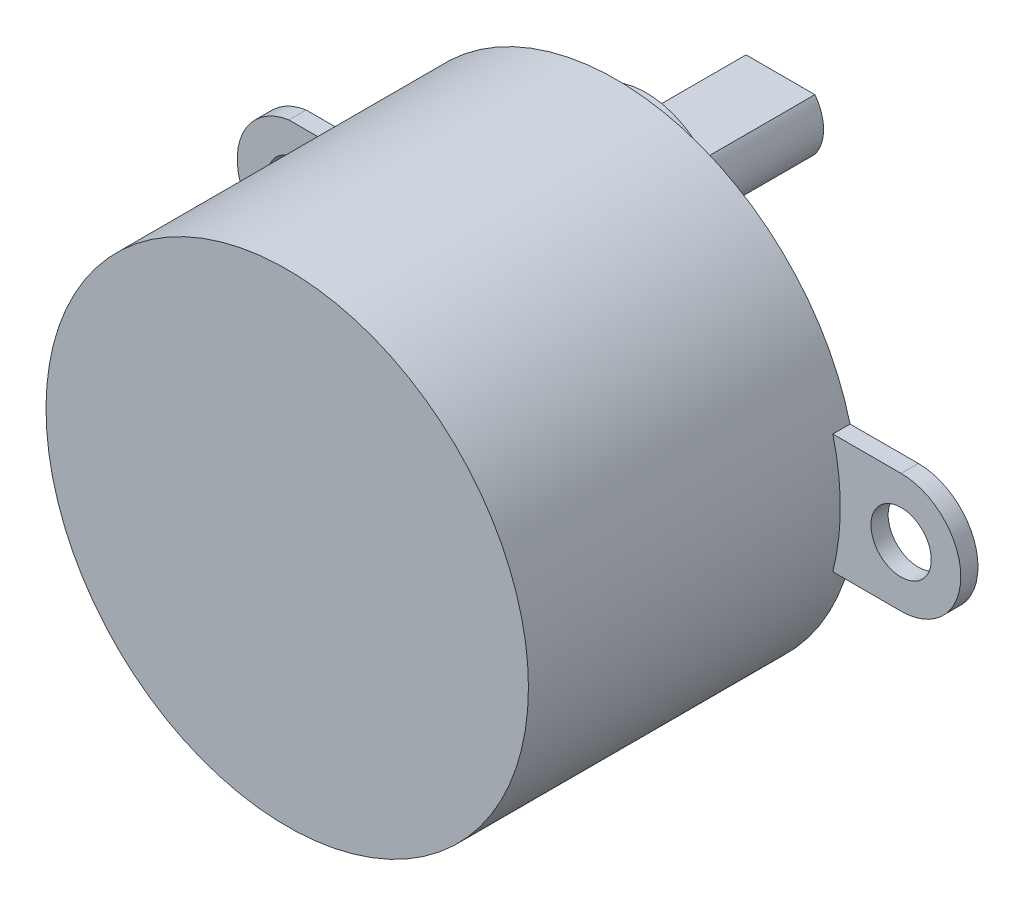
ISO-10303-21;
HEADER;
FILE_DESCRIPTION(('STEP AP214'),'2;1');
FILE_NAME('part.step','',(''),(''),'','','');
FILE_SCHEMA(('AUTOMOTIVE_DESIGN { 1 0 10303 214 1 1 1 1 }'));
ENDSEC;
DATA;
#1=APPLICATION_CONTEXT('core data for automotive mechanical design processes');
#2=APPLICATION_PROTOCOL_DEFINITION('international standard','automotive_design',2000,#1);
#3=PRODUCT_CONTEXT('',#1,'mechanical');
#4=PRODUCT('Part','Part','',(#3));
#5=PRODUCT_RELATED_PRODUCT_CATEGORY('part','',(#4));
#6=PRODUCT_DEFINITION_FORMATION('','',#4);
#7=PRODUCT_DEFINITION_CONTEXT('part definition',#1,'design');
#8=PRODUCT_DEFINITION('design','',#6,#7);
#9=PRODUCT_DEFINITION_SHAPE('','',#8);
#10=(LENGTH_UNIT() NAMED_UNIT(*) SI_UNIT(.MILLI.,.METRE.));
#11=(NAMED_UNIT(*) PLANE_ANGLE_UNIT() SI_UNIT($,.RADIAN.));
#12=(NAMED_UNIT(*) SI_UNIT($,.STERADIAN.) SOLID_ANGLE_UNIT());
#13=UNCERTAINTY_MEASURE_WITH_UNIT(LENGTH_MEASURE(1.E-05),#10,'distance_accuracy_value','');
#14=(GEOMETRIC_REPRESENTATION_CONTEXT(3) GLOBAL_UNCERTAINTY_ASSIGNED_CONTEXT((#13)) GLOBAL_UNIT_ASSIGNED_CONTEXT((#10,
#11,#12)) REPRESENTATION_CONTEXT('',''));
#15=CARTESIAN_POINT('',(0.,0.,0.));
#16=DIRECTION('',(0.,0.,1.));
#17=DIRECTION('',(1.,0.,0.));
#18=AXIS2_PLACEMENT_3D('',#15,#16,#17);
#19=CARTESIAN_POINT('',(0.,0.,19.1));
#20=DIRECTION('',(0.,0.,-1.));
#21=DIRECTION('',(-1.,0.,0.));
#22=AXIS2_PLACEMENT_3D('',#19,#20,#21);
#23=CYLINDRICAL_SURFACE('',#22,14.);
#24=CARTESIAN_POINT('',(0.,0.,19.1));
#25=DIRECTION('',(0.,0.,1.));
#26=DIRECTION('',(1.,0.,0.));
#27=AXIS2_PLACEMENT_3D('',#24,#25,#26);
#28=CIRCLE('',#27,14.);
#29=CARTESIAN_POINT('',(14.,0.,19.1));
#30=VERTEX_POINT('',#29);
#31=EDGE_CURVE('E11',#30,#30,#28,.T.);
#32=ORIENTED_EDGE('',*,*,#31,.F.);
#33=EDGE_LOOP('',(#32));
#34=FACE_BOUND('',#33,.T.);
#35=DIRECTION('',(0.,0.,-1.));
#36=VECTOR('',#35,1.);
#37=CARTESIAN_POINT('',(13.5647981073265,3.46356064007417,1.));
#38=LINE('',#37,#36);
#39=CARTESIAN_POINT('',(13.5647981073265,3.46356064007417,1.));
#40=VERTEX_POINT('',#39);
#41=CARTESIAN_POINT('',(13.5647981073265,3.46356064007417,0.));
#42=VERTEX_POINT('',#41);
#43=EDGE_CURVE('E142',#40,#42,#38,.T.);
#44=ORIENTED_EDGE('',*,*,#43,.T.);
#45=CARTESIAN_POINT('',(0.,0.,0.));
#46=DIRECTION('',(0.,0.,1.));
#47=DIRECTION('',(1.,0.,0.));
#48=AXIS2_PLACEMENT_3D('',#45,#46,#47);
#49=CIRCLE('',#48,14.);
#50=CARTESIAN_POINT('',(-13.5647981073265,3.46356064007417,0.));
#51=VERTEX_POINT('',#50);
#52=EDGE_CURVE('E250',#42,#51,#49,.T.);
#53=ORIENTED_EDGE('',*,*,#52,.T.);
#54=DIRECTION('',(0.,0.,-1.));
#55=VECTOR('',#54,1.);
#56=CARTESIAN_POINT('',(-13.5647981073265,3.46356064007417,1.));
#57=LINE('',#56,#55);
#58=CARTESIAN_POINT('',(-13.5647981073265,3.46356064007417,1.));
#59=VERTEX_POINT('',#58);
#60=EDGE_CURVE('E188',#59,#51,#57,.T.);
#61=ORIENTED_EDGE('',*,*,#60,.F.);
#62=CARTESIAN_POINT('',(0.,0.,1.));
#63=DIRECTION('',(0.,0.,1.));
#64=DIRECTION('',(1.,0.,0.));
#65=AXIS2_PLACEMENT_3D('',#62,#63,#64);
#66=CIRCLE('',#65,14.);
#67=CARTESIAN_POINT('',(-13.5647981073265,-3.46356064007417,1.));
#68=VERTEX_POINT('',#67);
#69=EDGE_CURVE('E186',#59,#68,#66,.T.);
#70=ORIENTED_EDGE('',*,*,#69,.T.);
#71=DIRECTION('',(0.,0.,-1.));
#72=VECTOR('',#71,1.);
#73=CARTESIAN_POINT('',(-13.5647981073265,-3.46356064007417,1.));
#74=LINE('',#73,#72);
#75=CARTESIAN_POINT('',(-13.5647981073265,-3.46356064007417,0.));
#76=VERTEX_POINT('',#75);
#77=EDGE_CURVE('E201',#68,#76,#74,.T.);
#78=ORIENTED_EDGE('',*,*,#77,.T.);
#79=CARTESIAN_POINT('',(13.5647981073265,-3.46356064007417,0.));
#80=VERTEX_POINT('',#79);
#81=EDGE_CURVE('E46',#76,#80,#49,.T.);
#82=ORIENTED_EDGE('',*,*,#81,.T.);
#83=DIRECTION('',(0.,0.,-1.));
#84=VECTOR('',#83,1.);
#85=CARTESIAN_POINT('',(13.5647981073265,-3.46356064007417,1.));
#86=LINE('',#85,#84);
#87=CARTESIAN_POINT('',(13.5647981073265,-3.46356064007417,1.));
#88=VERTEX_POINT('',#87);
#89=EDGE_CURVE('E62',#88,#80,#86,.T.);
#90=ORIENTED_EDGE('',*,*,#89,.F.);
#91=CARTESIAN_POINT('',(0.,0.,1.));
#92=DIRECTION('',(0.,0.,1.));
#93=DIRECTION('',(1.,0.,0.));
#94=AXIS2_PLACEMENT_3D('',#91,#92,#93);
#95=CIRCLE('',#94,14.);
#96=EDGE_CURVE('E57',#88,#40,#95,.T.);
#97=ORIENTED_EDGE('',*,*,#96,.T.);
#98=EDGE_LOOP('',(#44,#53,#61,#70,#78,#82,#90,#97));
#99=FACE_BOUND('',#98,.T.);
#100=ADVANCED_FACE('F43',(#34,#99),#23,.T.);
#101=CARTESIAN_POINT('',(0.,6.49995208758909,-9.5));
#102=DIRECTION('',(0.,-1.,0.));
#103=DIRECTION('',(0.,0.,-1.));
#104=AXIS2_PLACEMENT_3D('',#101,#102,#103);
#105=PLANE('',#104);
#106=DIRECTION('',(0.,0.,1.));
#107=VECTOR('',#106,1.);
#108=CARTESIAN_POINT('',(2.0276874751277,6.49995208758909,-9.5));
#109=LINE('',#108,#107);
#110=CARTESIAN_POINT('',(2.0276874751277,6.49995208758909,-9.5));
#111=VERTEX_POINT('',#110);
#112=CARTESIAN_POINT('',(2.0276874751277,6.49995208758909,-2.3));
#113=VERTEX_POINT('',#112);
#114=EDGE_CURVE('E225',#111,#113,#109,.T.);
#115=ORIENTED_EDGE('',*,*,#114,.T.);
#116=DIRECTION('',(1.,0.,0.));
#117=VECTOR('',#116,1.);
#118=CARTESIAN_POINT('',(0.,6.49995208758909,-2.3));
#119=LINE('',#118,#117);
#120=CARTESIAN_POINT('',(-1.97231252487231,6.49995208758909,-2.3));
#121=VERTEX_POINT('',#120);
#122=EDGE_CURVE('E209',#121,#113,#119,.T.);
#123=ORIENTED_EDGE('',*,*,#122,.F.);
#124=DIRECTION('',(0.,0.,1.));
#125=VECTOR('',#124,1.);
#126=CARTESIAN_POINT('',(-1.97231252487231,6.49995208758909,-9.5));
#127=LINE('',#126,#125);
#128=CARTESIAN_POINT('',(-1.97231252487231,6.49995208758909,-9.5));
#129=VERTEX_POINT('',#128);
#130=EDGE_CURVE('E226',#129,#121,#127,.T.);
#131=ORIENTED_EDGE('',*,*,#130,.F.);
#132=DIRECTION('',(1.,0.,0.));
#133=VECTOR('',#132,1.);
#134=CARTESIAN_POINT('',(0.,6.49995208758909,-9.5));
#135=LINE('',#134,#133);
#136=EDGE_CURVE('E214',#129,#111,#135,.T.);
#137=ORIENTED_EDGE('',*,*,#136,.T.);
#138=EDGE_LOOP('',(#115,#123,#131,#137));
#139=FACE_BOUND('',#138,.T.);
#140=ADVANCED_FACE('F272',(#139),#105,.T.);
#141=CARTESIAN_POINT('',(0.,0.,19.1));
#142=DIRECTION('',(0.,0.,1.));
#143=DIRECTION('',(1.,0.,0.));
#144=AXIS2_PLACEMENT_3D('',#141,#142,#143);
#145=PLANE('',#144);
#146=ORIENTED_EDGE('',*,*,#31,.T.);
#147=EDGE_LOOP('',(#146));
#148=FACE_BOUND('',#147,.T.);
#149=ADVANCED_FACE('F269',(#148),#145,.T.);
#150=CARTESIAN_POINT('',(0.,0.,0.));
#151=DIRECTION('',(0.,0.,1.));
#152=DIRECTION('',(1.,0.,0.));
#153=AXIS2_PLACEMENT_3D('',#150,#151,#152);
#154=PLANE('',#153);
#155=CARTESIAN_POINT('',(0.0276874751276953,7.99995208758909,0.));
#156=DIRECTION('',(0.,0.,1.));
#157=DIRECTION('',(1.,0.,0.));
#158=AXIS2_PLACEMENT_3D('',#155,#156,#157);
#159=CIRCLE('',#158,4.5);
#160=CARTESIAN_POINT('',(4.52768747512769,7.99995208758909,0.));
#161=VERTEX_POINT('',#160);
#162=EDGE_CURVE('E243',#161,#161,#159,.T.);
#163=ORIENTED_EDGE('',*,*,#162,.T.);
#164=EDGE_LOOP('',(#163));
#165=FACE_BOUND('',#164,.T.);
#166=ORIENTED_EDGE('',*,*,#81,.F.);
#167=DIRECTION('',(1.,0.,0.));
#168=VECTOR('',#167,1.);
#169=CARTESIAN_POINT('',(0.,-3.46356064007417,0.));
#170=LINE('',#169,#168);
#171=CARTESIAN_POINT('',(-18.0037337516278,-3.46356064007417,0.));
#172=VERTEX_POINT('',#171);
#173=EDGE_CURVE('E177',#172,#76,#170,.T.);
#174=ORIENTED_EDGE('',*,*,#173,.F.);
#175=CARTESIAN_POINT('',(-17.5,0.,0.));
#176=DIRECTION('',(0.,0.,1.));
#177=DIRECTION('',(1.,0.,0.));
#178=AXIS2_PLACEMENT_3D('',#175,#176,#177);
#179=CIRCLE('',#178,3.5);
#180=CARTESIAN_POINT('',(-18.0037337516278,3.46356064007417,0.));
#181=VERTEX_POINT('',#180);
#182=EDGE_CURVE('E194',#181,#172,#179,.T.);
#183=ORIENTED_EDGE('',*,*,#182,.F.);
#184=DIRECTION('',(1.,0.,0.));
#185=VECTOR('',#184,1.);
#186=CARTESIAN_POINT('',(0.,3.46356064007417,0.));
#187=LINE('',#186,#185);
#188=EDGE_CURVE('E191',#181,#51,#187,.T.);
#189=ORIENTED_EDGE('',*,*,#188,.T.);
#190=ORIENTED_EDGE('',*,*,#52,.F.);
#191=DIRECTION('',(-1.,0.,0.));
#192=VECTOR('',#191,1.);
#193=CARTESIAN_POINT('',(0.,3.46356064007417,0.));
#194=LINE('',#193,#192);
#195=CARTESIAN_POINT('',(17.5276874751277,3.46356064007417,0.));
#196=VERTEX_POINT('',#195);
#197=EDGE_CURVE('E166',#196,#42,#194,.T.);
#198=ORIENTED_EDGE('',*,*,#197,.F.);
#199=CARTESIAN_POINT('',(17.5276874751277,0.,0.));
#200=DIRECTION('',(0.,0.,1.));
#201=DIRECTION('',(1.,0.,0.));
#202=AXIS2_PLACEMENT_3D('',#199,#200,#201);
#203=CIRCLE('',#202,3.46356064007417);
#204=CARTESIAN_POINT('',(17.5276874751277,-3.46356064007417,0.));
#205=VERTEX_POINT('',#204);
#206=EDGE_CURVE('E137',#196,#205,#203,.F.);
#207=ORIENTED_EDGE('',*,*,#206,.T.);
#208=DIRECTION('',(-1.,0.,0.));
#209=VECTOR('',#208,1.);
#210=CARTESIAN_POINT('',(0.,-3.46356064007417,0.));
#211=LINE('',#210,#209);
#212=EDGE_CURVE('E156',#205,#80,#211,.T.);
#213=ORIENTED_EDGE('',*,*,#212,.T.);
#214=EDGE_LOOP('',(#166,#174,#183,#189,#190,#198,#207,#213));
#215=FACE_BOUND('',#214,.T.);
#216=CARTESIAN_POINT('',(-17.5,0.,0.));
#217=DIRECTION('',(0.,0.,1.));
#218=DIRECTION('',(1.,0.,0.));
#219=AXIS2_PLACEMENT_3D('',#216,#217,#218);
#220=CIRCLE('',#219,1.75);
#221=CARTESIAN_POINT('',(-15.75,0.,0.));
#222=VERTEX_POINT('',#221);
#223=EDGE_CURVE('E141',#222,#222,#220,.T.);
#224=ORIENTED_EDGE('',*,*,#223,.T.);
#225=EDGE_LOOP('',(#224));
#226=FACE_BOUND('',#225,.T.);
#227=CARTESIAN_POINT('',(17.5276874751277,0.,0.));
#228=DIRECTION('',(0.,0.,1.));
#229=DIRECTION('',(1.,0.,0.));
#230=AXIS2_PLACEMENT_3D('',#227,#228,#229);
#231=CIRCLE('',#230,1.75);
#232=CARTESIAN_POINT('',(19.2776874751277,0.,0.));
#233=VERTEX_POINT('',#232);
#234=EDGE_CURVE('E153',#233,#233,#231,.T.);
#235=ORIENTED_EDGE('',*,*,#234,.T.);
#236=EDGE_LOOP('',(#235));
#237=FACE_BOUND('',#236,.T.);
#238=ADVANCED_FACE('F254',(#165,#215,#226,#237),#154,.F.);
#239=CARTESIAN_POINT('',(0.0276874751276953,7.99995208758909,-1.7));
#240=DIRECTION('',(0.,0.,1.));
#241=DIRECTION('',(1.,0.,0.));
#242=AXIS2_PLACEMENT_3D('',#239,#240,#241);
#243=CYLINDRICAL_SURFACE('',#242,4.5);
#244=CARTESIAN_POINT('',(0.0276874751276953,7.99995208758909,-1.7));
#245=DIRECTION('',(0.,0.,1.));
#246=DIRECTION('',(1.,0.,0.));
#247=AXIS2_PLACEMENT_3D('',#244,#245,#246);
#248=CIRCLE('',#247,4.5);
#249=CARTESIAN_POINT('',(4.52768747512769,7.99995208758909,-1.7));
#250=VERTEX_POINT('',#249);
#251=EDGE_CURVE('E247',#250,#250,#248,.T.);
#252=ORIENTED_EDGE('',*,*,#251,.T.);
#253=EDGE_LOOP('',(#252));
#254=FACE_BOUND('',#253,.T.);
#255=ORIENTED_EDGE('',*,*,#162,.F.);
#256=EDGE_LOOP('',(#255));
#257=FACE_BOUND('',#256,.T.);
#258=ADVANCED_FACE('F257',(#254,#257),#243,.T.);
#259=CARTESIAN_POINT('',(0.,0.,-1.7));
#260=DIRECTION('',(0.,0.,1.));
#261=DIRECTION('',(1.,0.,0.));
#262=AXIS2_PLACEMENT_3D('',#259,#260,#261);
#263=PLANE('',#262);
#264=CARTESIAN_POINT('',(0.0276874751276953,7.99995208758909,-1.7));
#265=DIRECTION('',(0.,0.,1.));
#266=DIRECTION('',(1.,0.,0.));
#267=AXIS2_PLACEMENT_3D('',#264,#265,#266);
#268=CIRCLE('',#267,2.5);
#269=CARTESIAN_POINT('',(2.5276874751277,7.99995208758909,-1.7));
#270=VERTEX_POINT('',#269);
#271=EDGE_CURVE('E244',#270,#270,#268,.T.);
#272=ORIENTED_EDGE('',*,*,#271,.T.);
#273=EDGE_LOOP('',(#272));
#274=FACE_BOUND('',#273,.T.);
#275=ORIENTED_EDGE('',*,*,#251,.F.);
#276=EDGE_LOOP('',(#275));
#277=FACE_BOUND('',#276,.T.);
#278=ADVANCED_FACE('F259',(#274,#277),#263,.F.);
#279=CARTESIAN_POINT('',(0.0276874751276953,7.99995208758909,-2.3));
#280=DIRECTION('',(0.,0.,1.));
#281=DIRECTION('',(1.,0.,0.));
#282=AXIS2_PLACEMENT_3D('',#279,#280,#281);
#283=CYLINDRICAL_SURFACE('',#282,2.5);
#284=ORIENTED_EDGE('',*,*,#271,.F.);
#285=EDGE_LOOP('',(#284));
#286=FACE_BOUND('',#285,.T.);
#287=CARTESIAN_POINT('',(0.0276874751276953,7.99995208758909,-2.3));
#288=DIRECTION('',(0.,0.,1.));
#289=DIRECTION('',(1.,0.,0.));
#290=AXIS2_PLACEMENT_3D('',#287,#288,#289);
#291=CIRCLE('',#290,2.5);
#292=EDGE_CURVE('E211',#121,#113,#291,.T.);
#293=ORIENTED_EDGE('',*,*,#292,.T.);
#294=ORIENTED_EDGE('',*,*,#114,.F.);
#295=CARTESIAN_POINT('',(0.0276874751276953,7.99995208758909,-9.5));
#296=DIRECTION('',(0.,0.,1.));
#297=DIRECTION('',(1.,0.,0.));
#298=AXIS2_PLACEMENT_3D('',#295,#296,#297);
#299=CIRCLE('',#298,2.5);
#300=CARTESIAN_POINT('',(2.02768747512769,9.49995208758909,-9.5));
#301=VERTEX_POINT('',#300);
#302=EDGE_CURVE('E217',#111,#301,#299,.T.);
#303=ORIENTED_EDGE('',*,*,#302,.T.);
#304=DIRECTION('',(0.,0.,1.));
#305=VECTOR('',#304,1.);
#306=CARTESIAN_POINT('',(2.02768747512769,9.49995208758909,-9.5));
#307=LINE('',#306,#305);
#308=CARTESIAN_POINT('',(2.02768747512769,9.49995208758909,-2.3));
#309=VERTEX_POINT('',#308);
#310=EDGE_CURVE('E233',#301,#309,#307,.T.);
#311=ORIENTED_EDGE('',*,*,#310,.T.);
#312=CARTESIAN_POINT('',(0.0276874751276953,7.99995208758909,-2.3));
#313=DIRECTION('',(0.,0.,1.));
#314=DIRECTION('',(1.,0.,0.));
#315=AXIS2_PLACEMENT_3D('',#312,#313,#314);
#316=CIRCLE('',#315,2.5);
#317=CARTESIAN_POINT('',(-1.97231252487231,9.49995208758909,-2.3));
#318=VERTEX_POINT('',#317);
#319=EDGE_CURVE('E240',#309,#318,#316,.T.);
#320=ORIENTED_EDGE('',*,*,#319,.T.);
#321=DIRECTION('',(0.,0.,1.));
#322=VECTOR('',#321,1.);
#323=CARTESIAN_POINT('',(-1.97231252487231,9.49995208758909,-9.5));
#324=LINE('',#323,#322);
#325=CARTESIAN_POINT('',(-1.97231252487231,9.49995208758909,-9.5));
#326=VERTEX_POINT('',#325);
#327=EDGE_CURVE('E230',#326,#318,#324,.T.);
#328=ORIENTED_EDGE('',*,*,#327,.F.);
#329=CARTESIAN_POINT('',(0.0276874751276953,7.99995208758909,-9.5));
#330=DIRECTION('',(0.,0.,1.));
#331=DIRECTION('',(1.,0.,0.));
#332=AXIS2_PLACEMENT_3D('',#329,#330,#331);
#333=CIRCLE('',#332,2.5);
#334=EDGE_CURVE('E222',#326,#129,#333,.T.);
#335=ORIENTED_EDGE('',*,*,#334,.T.);
#336=ORIENTED_EDGE('',*,*,#130,.T.);
#337=EDGE_LOOP('',(#293,#294,#303,#311,#320,#328,#335,#336));
#338=FACE_BOUND('',#337,.T.);
#339=ADVANCED_FACE('F266',(#286,#338),#283,.T.);
#340=CARTESIAN_POINT('',(0.,0.,-2.3));
#341=DIRECTION('',(0.,0.,1.));
#342=DIRECTION('',(1.,0.,0.));
#343=AXIS2_PLACEMENT_3D('',#340,#341,#342);
#344=PLANE('',#343);
#345=DIRECTION('',(1.,0.,0.));
#346=VECTOR('',#345,1.);
#347=CARTESIAN_POINT('',(0.,9.49995208758909,-2.3));
#348=LINE('',#347,#346);
#349=EDGE_CURVE('E229',#318,#309,#348,.T.);
#350=ORIENTED_EDGE('',*,*,#349,.F.);
#351=ORIENTED_EDGE('',*,*,#319,.F.);
#352=EDGE_LOOP('',(#350,#351));
#353=FACE_BOUND('',#352,.T.);
#354=ADVANCED_FACE('F331',(#353),#344,.F.);
#355=CARTESIAN_POINT('',(0.,9.49995208758909,-9.5));
#356=DIRECTION('',(0.,-1.,0.));
#357=DIRECTION('',(0.,0.,-1.));
#358=AXIS2_PLACEMENT_3D('',#355,#356,#357);
#359=PLANE('',#358);
#360=ORIENTED_EDGE('',*,*,#327,.T.);
#361=ORIENTED_EDGE('',*,*,#349,.T.);
#362=ORIENTED_EDGE('',*,*,#310,.F.);
#363=DIRECTION('',(1.,0.,0.));
#364=VECTOR('',#363,1.);
#365=CARTESIAN_POINT('',(0.,9.49995208758909,-9.5));
#366=LINE('',#365,#364);
#367=EDGE_CURVE('E220',#326,#301,#366,.T.);
#368=ORIENTED_EDGE('',*,*,#367,.F.);
#369=EDGE_LOOP('',(#360,#361,#362,#368));
#370=FACE_BOUND('',#369,.T.);
#371=ADVANCED_FACE('F328',(#370),#359,.F.);
#372=CARTESIAN_POINT('',(0.,0.,-9.5));
#373=DIRECTION('',(0.,0.,1.));
#374=DIRECTION('',(1.,0.,0.));
#375=AXIS2_PLACEMENT_3D('',#372,#373,#374);
#376=PLANE('',#375);
#377=ORIENTED_EDGE('',*,*,#136,.F.);
#378=ORIENTED_EDGE('',*,*,#334,.F.);
#379=ORIENTED_EDGE('',*,*,#367,.T.);
#380=ORIENTED_EDGE('',*,*,#302,.F.);
#381=EDGE_LOOP('',(#377,#378,#379,#380));
#382=FACE_BOUND('',#381,.T.);
#383=ADVANCED_FACE('F324',(#382),#376,.F.);
#384=CARTESIAN_POINT('',(0.,0.,-2.3));
#385=DIRECTION('',(0.,0.,1.));
#386=DIRECTION('',(1.,0.,0.));
#387=AXIS2_PLACEMENT_3D('',#384,#385,#386);
#388=PLANE('',#387);
#389=ORIENTED_EDGE('',*,*,#122,.T.);
#390=ORIENTED_EDGE('',*,*,#292,.F.);
#391=EDGE_LOOP('',(#389,#390));
#392=FACE_BOUND('',#391,.T.);
#393=ADVANCED_FACE('F317',(#392),#388,.F.);
#394=CARTESIAN_POINT('',(0.,3.46356064007417,1.));
#395=DIRECTION('',(0.,1.,0.));
#396=DIRECTION('',(0.,0.,1.));
#397=AXIS2_PLACEMENT_3D('',#394,#395,#396);
#398=PLANE('',#397);
#399=ORIENTED_EDGE('',*,*,#188,.F.);
#400=DIRECTION('',(0.,0.,-1.));
#401=VECTOR('',#400,1.);
#402=CARTESIAN_POINT('',(-18.0037337516278,3.46356064007417,1.));
#403=LINE('',#402,#401);
#404=CARTESIAN_POINT('',(-18.0037337516278,3.46356064007417,1.));
#405=VERTEX_POINT('',#404);
#406=EDGE_CURVE('E207',#405,#181,#403,.T.);
#407=ORIENTED_EDGE('',*,*,#406,.F.);
#408=DIRECTION('',(1.,0.,0.));
#409=VECTOR('',#408,1.);
#410=CARTESIAN_POINT('',(0.,3.46356064007417,1.));
#411=LINE('',#410,#409);
#412=EDGE_CURVE('E176',#405,#59,#411,.T.);
#413=ORIENTED_EDGE('',*,*,#412,.T.);
#414=ORIENTED_EDGE('',*,*,#60,.T.);
#415=EDGE_LOOP('',(#399,#407,#413,#414));
#416=FACE_BOUND('',#415,.T.);
#417=ADVANCED_FACE('F313',(#416),#398,.T.);
#418=CARTESIAN_POINT('',(-17.5,0.,1.));
#419=DIRECTION('',(0.,0.,-1.));
#420=DIRECTION('',(-1.,0.,0.));
#421=AXIS2_PLACEMENT_3D('',#418,#419,#420);
#422=CYLINDRICAL_SURFACE('',#421,3.5);
#423=ORIENTED_EDGE('',*,*,#182,.T.);
#424=DIRECTION('',(0.,0.,-1.));
#425=VECTOR('',#424,1.);
#426=CARTESIAN_POINT('',(-18.0037337516278,-3.46356064007417,1.));
#427=LINE('',#426,#425);
#428=CARTESIAN_POINT('',(-18.0037337516278,-3.46356064007417,1.));
#429=VERTEX_POINT('',#428);
#430=EDGE_CURVE('E204',#429,#172,#427,.T.);
#431=ORIENTED_EDGE('',*,*,#430,.F.);
#432=CARTESIAN_POINT('',(-17.5,0.,1.));
#433=DIRECTION('',(0.,0.,1.));
#434=DIRECTION('',(1.,0.,0.));
#435=AXIS2_PLACEMENT_3D('',#432,#433,#434);
#436=CIRCLE('',#435,3.5);
#437=EDGE_CURVE('E180',#405,#429,#436,.T.);
#438=ORIENTED_EDGE('',*,*,#437,.F.);
#439=ORIENTED_EDGE('',*,*,#406,.T.);
#440=EDGE_LOOP('',(#423,#431,#438,#439));
#441=FACE_BOUND('',#440,.T.);
#442=ADVANCED_FACE('F309',(#441),#422,.T.);
#443=CARTESIAN_POINT('',(0.,-3.46356064007417,1.));
#444=DIRECTION('',(0.,1.,0.));
#445=DIRECTION('',(0.,0.,1.));
#446=AXIS2_PLACEMENT_3D('',#443,#444,#445);
#447=PLANE('',#446);
#448=ORIENTED_EDGE('',*,*,#173,.T.);
#449=ORIENTED_EDGE('',*,*,#77,.F.);
#450=DIRECTION('',(1.,0.,0.));
#451=VECTOR('',#450,1.);
#452=CARTESIAN_POINT('',(0.,-3.46356064007417,1.));
#453=LINE('',#452,#451);
#454=EDGE_CURVE('E183',#429,#68,#453,.T.);
#455=ORIENTED_EDGE('',*,*,#454,.F.);
#456=ORIENTED_EDGE('',*,*,#430,.T.);
#457=EDGE_LOOP('',(#448,#449,#455,#456));
#458=FACE_BOUND('',#457,.T.);
#459=ADVANCED_FACE('F306',(#458),#447,.F.);
#460=CARTESIAN_POINT('',(-17.5,0.,1.));
#461=DIRECTION('',(0.,0.,-1.));
#462=DIRECTION('',(-1.,0.,0.));
#463=AXIS2_PLACEMENT_3D('',#460,#461,#462);
#464=CYLINDRICAL_SURFACE('',#463,1.75);
#465=CARTESIAN_POINT('',(-17.5,0.,1.));
#466=DIRECTION('',(0.,0.,1.));
#467=DIRECTION('',(1.,0.,0.));
#468=AXIS2_PLACEMENT_3D('',#465,#466,#467);
#469=CIRCLE('',#468,1.75);
#470=CARTESIAN_POINT('',(-15.75,0.,1.));
#471=VERTEX_POINT('',#470);
#472=EDGE_CURVE('E173',#471,#471,#469,.T.);
#473=ORIENTED_EDGE('',*,*,#472,.T.);
#474=EDGE_LOOP('',(#473));
#475=FACE_BOUND('',#474,.T.);
#476=ORIENTED_EDGE('',*,*,#223,.F.);
#477=EDGE_LOOP('',(#476));
#478=FACE_BOUND('',#477,.T.);
#479=ADVANCED_FACE('F304',(#475,#478),#464,.F.);
#480=CARTESIAN_POINT('',(0.,0.,1.));
#481=DIRECTION('',(0.,0.,1.));
#482=DIRECTION('',(1.,0.,0.));
#483=AXIS2_PLACEMENT_3D('',#480,#481,#482);
#484=PLANE('',#483);
#485=ORIENTED_EDGE('',*,*,#472,.F.);
#486=EDGE_LOOP('',(#485));
#487=FACE_BOUND('',#486,.T.);
#488=ORIENTED_EDGE('',*,*,#412,.F.);
#489=ORIENTED_EDGE('',*,*,#437,.T.);
#490=ORIENTED_EDGE('',*,*,#454,.T.);
#491=ORIENTED_EDGE('',*,*,#69,.F.);
#492=EDGE_LOOP('',(#488,#489,#490,#491));
#493=FACE_BOUND('',#492,.T.);
#494=ADVANCED_FACE('F301',(#487,#493),#484,.T.);
#495=CARTESIAN_POINT('',(17.5276874751277,0.,1.));
#496=DIRECTION('',(0.,0.,-1.));
#497=DIRECTION('',(-1.,0.,0.));
#498=AXIS2_PLACEMENT_3D('',#495,#496,#497);
#499=CYLINDRICAL_SURFACE('',#498,3.46356064007417);
#500=ORIENTED_EDGE('',*,*,#206,.F.);
#501=DIRECTION('',(0.,0.,-1.));
#502=VECTOR('',#501,1.);
#503=CARTESIAN_POINT('',(17.5276874751277,3.46356064007417,1.));
#504=LINE('',#503,#502);
#505=CARTESIAN_POINT('',(17.5276874751277,3.46356064007417,1.));
#506=VERTEX_POINT('',#505);
#507=EDGE_CURVE('E130',#506,#196,#504,.T.);
#508=ORIENTED_EDGE('',*,*,#507,.F.);
#509=CARTESIAN_POINT('',(17.5276874751277,0.,1.));
#510=DIRECTION('',(0.,0.,1.));
#511=DIRECTION('',(1.,0.,0.));
#512=AXIS2_PLACEMENT_3D('',#509,#510,#511);
#513=CIRCLE('',#512,3.46356064007417);
#514=CARTESIAN_POINT('',(17.5276874751277,-3.46356064007417,1.));
#515=VERTEX_POINT('',#514);
#516=EDGE_CURVE('E134',#506,#515,#513,.F.);
#517=ORIENTED_EDGE('',*,*,#516,.T.);
#518=DIRECTION('',(0.,0.,-1.));
#519=VECTOR('',#518,1.);
#520=CARTESIAN_POINT('',(17.5276874751277,-3.46356064007417,1.));
#521=LINE('',#520,#519);
#522=EDGE_CURVE('E164',#515,#205,#521,.T.);
#523=ORIENTED_EDGE('',*,*,#522,.T.);
#524=EDGE_LOOP('',(#500,#508,#517,#523));
#525=FACE_BOUND('',#524,.T.);
#526=ADVANCED_FACE('F132',(#525),#499,.T.);
#527=CARTESIAN_POINT('',(0.,3.46356064007417,1.));
#528=DIRECTION('',(0.,-1.,0.));
#529=DIRECTION('',(0.,0.,-1.));
#530=AXIS2_PLACEMENT_3D('',#527,#528,#529);
#531=PLANE('',#530);
#532=ORIENTED_EDGE('',*,*,#197,.T.);
#533=ORIENTED_EDGE('',*,*,#43,.F.);
#534=DIRECTION('',(-1.,0.,0.));
#535=VECTOR('',#534,1.);
#536=CARTESIAN_POINT('',(0.,3.46356064007417,1.));
#537=LINE('',#536,#535);
#538=EDGE_CURVE('E145',#506,#40,#537,.T.);
#539=ORIENTED_EDGE('',*,*,#538,.F.);
#540=ORIENTED_EDGE('',*,*,#507,.T.);
#541=EDGE_LOOP('',(#532,#533,#539,#540));
#542=FACE_BOUND('',#541,.T.);
#543=ADVANCED_FACE('F146',(#542),#531,.F.);
#544=CARTESIAN_POINT('',(0.,-3.46356064007417,1.));
#545=DIRECTION('',(0.,-1.,0.));
#546=DIRECTION('',(0.,0.,-1.));
#547=AXIS2_PLACEMENT_3D('',#544,#545,#546);
#548=PLANE('',#547);
#549=ORIENTED_EDGE('',*,*,#212,.F.);
#550=ORIENTED_EDGE('',*,*,#522,.F.);
#551=DIRECTION('',(-1.,0.,0.));
#552=VECTOR('',#551,1.);
#553=CARTESIAN_POINT('',(0.,-3.46356064007417,1.));
#554=LINE('',#553,#552);
#555=EDGE_CURVE('E152',#515,#88,#554,.T.);
#556=ORIENTED_EDGE('',*,*,#555,.T.);
#557=ORIENTED_EDGE('',*,*,#89,.T.);
#558=EDGE_LOOP('',(#549,#550,#556,#557));
#559=FACE_BOUND('',#558,.T.);
#560=ADVANCED_FACE('F286',(#559),#548,.T.);
#561=CARTESIAN_POINT('',(17.5276874751277,0.,1.));
#562=DIRECTION('',(0.,0.,-1.));
#563=DIRECTION('',(-1.,0.,0.));
#564=AXIS2_PLACEMENT_3D('',#561,#562,#563);
#565=CYLINDRICAL_SURFACE('',#564,1.75);
#566=CARTESIAN_POINT('',(17.5276874751277,0.,1.));
#567=DIRECTION('',(0.,0.,1.));
#568=DIRECTION('',(1.,0.,0.));
#569=AXIS2_PLACEMENT_3D('',#566,#567,#568);
#570=CIRCLE('',#569,1.75);
#571=CARTESIAN_POINT('',(19.2776874751277,0.,1.));
#572=VERTEX_POINT('',#571);
#573=EDGE_CURVE('E161',#572,#572,#570,.T.);
#574=ORIENTED_EDGE('',*,*,#573,.T.);
#575=EDGE_LOOP('',(#574));
#576=FACE_BOUND('',#575,.T.);
#577=ORIENTED_EDGE('',*,*,#234,.F.);
#578=EDGE_LOOP('',(#577));
#579=FACE_BOUND('',#578,.T.);
#580=ADVANCED_FACE('F288',(#576,#579),#565,.F.);
#581=CARTESIAN_POINT('',(0.,0.,1.));
#582=DIRECTION('',(0.,0.,1.));
#583=DIRECTION('',(1.,0.,0.));
#584=AXIS2_PLACEMENT_3D('',#581,#582,#583);
#585=PLANE('',#584);
#586=ORIENTED_EDGE('',*,*,#516,.F.);
#587=ORIENTED_EDGE('',*,*,#538,.T.);
#588=ORIENTED_EDGE('',*,*,#96,.F.);
#589=ORIENTED_EDGE('',*,*,#555,.F.);
#590=EDGE_LOOP('',(#586,#587,#588,#589));
#591=FACE_BOUND('',#590,.T.);
#592=ORIENTED_EDGE('',*,*,#573,.F.);
#593=EDGE_LOOP('',(#592));
#594=FACE_BOUND('',#593,.T.);
#595=ADVANCED_FACE('F149',(#591,#594),#585,.T.);
#596=CLOSED_SHELL('',(#100,#140,#149,#238,#258,#278,#339,#354,#371,#383,#393,#417,#442,#459,
#479,#494,#526,#543,#560,#580,#595));
#597=MANIFOLD_SOLID_BREP('B2',#596);
#598=ADVANCED_BREP_SHAPE_REPRESENTATION('',(#18,#597),#14);
#599=SHAPE_DEFINITION_REPRESENTATION(#9,#598);
ENDSEC;
END-ISO-10303-21;
